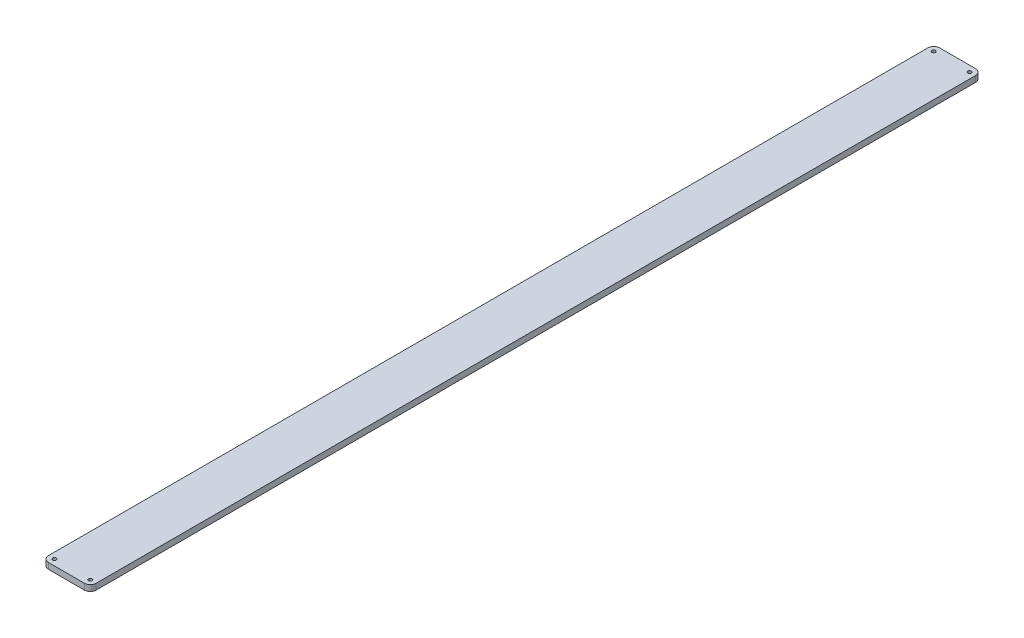
ISO-10303-21;
HEADER;
FILE_DESCRIPTION(('STEP AP214'),'2;1');
FILE_NAME('part.step','',(''),(''),'','','');
FILE_SCHEMA(('AUTOMOTIVE_DESIGN { 1 0 10303 214 1 1 1 1 }'));
ENDSEC;
DATA;
#1=APPLICATION_CONTEXT('core data for automotive mechanical design processes');
#2=APPLICATION_PROTOCOL_DEFINITION('international standard','automotive_design',2000,#1);
#3=PRODUCT_CONTEXT('',#1,'mechanical');
#4=PRODUCT('Part','Part','',(#3));
#5=PRODUCT_RELATED_PRODUCT_CATEGORY('part','',(#4));
#6=PRODUCT_DEFINITION_FORMATION('','',#4);
#7=PRODUCT_DEFINITION_CONTEXT('part definition',#1,'design');
#8=PRODUCT_DEFINITION('design','',#6,#7);
#9=PRODUCT_DEFINITION_SHAPE('','',#8);
#10=(LENGTH_UNIT() NAMED_UNIT(*) SI_UNIT(.MILLI.,.METRE.));
#11=(NAMED_UNIT(*) PLANE_ANGLE_UNIT() SI_UNIT($,.RADIAN.));
#12=(NAMED_UNIT(*) SI_UNIT($,.STERADIAN.) SOLID_ANGLE_UNIT());
#13=UNCERTAINTY_MEASURE_WITH_UNIT(LENGTH_MEASURE(1.E-05),#10,'distance_accuracy_value','');
#14=(GEOMETRIC_REPRESENTATION_CONTEXT(3) GLOBAL_UNCERTAINTY_ASSIGNED_CONTEXT((#13)) GLOBAL_UNIT_ASSIGNED_CONTEXT((#10,
#11,#12)) REPRESENTATION_CONTEXT('',''));
#15=CARTESIAN_POINT('',(0.,0.,0.));
#16=DIRECTION('',(0.,0.,1.));
#17=DIRECTION('',(1.,0.,0.));
#18=AXIS2_PLACEMENT_3D('',#15,#16,#17);
#19=CARTESIAN_POINT('',(0.,5.,0.));
#20=DIRECTION('',(0.,-1.,0.));
#21=DIRECTION('',(0.,0.,-1.));
#22=AXIS2_PLACEMENT_3D('',#19,#20,#21);
#23=PLANE('',#22);
#24=DIRECTION('',(-1.,0.,0.));
#25=VECTOR('',#24,1.);
#26=CARTESIAN_POINT('',(-20.,5.,-373.));
#27=LINE('',#26,#25);
#28=CARTESIAN_POINT('',(15.,5.,-373.));
#29=VERTEX_POINT('',#28);
#30=CARTESIAN_POINT('',(-15.,5.,-373.));
#31=VERTEX_POINT('',#30);
#32=EDGE_CURVE('E170',#29,#31,#27,.T.);
#33=ORIENTED_EDGE('',*,*,#32,.T.);
#34=CARTESIAN_POINT('',(-15.,5.,-368.));
#35=DIRECTION('',(0.,-1.,0.));
#36=DIRECTION('',(0.,0.,-1.));
#37=AXIS2_PLACEMENT_3D('',#34,#35,#36);
#38=CIRCLE('',#37,5.);
#39=CARTESIAN_POINT('',(-20.,5.,-368.));
#40=VERTEX_POINT('',#39);
#41=EDGE_CURVE('E150',#31,#40,#38,.F.);
#42=ORIENTED_EDGE('',*,*,#41,.T.);
#43=DIRECTION('',(0.,0.,1.));
#44=VECTOR('',#43,1.);
#45=CARTESIAN_POINT('',(-19.9999999999998,5.,373.));
#46=LINE('',#45,#44);
#47=CARTESIAN_POINT('',(-19.9999999999998,5.,368.));
#48=VERTEX_POINT('',#47);
#49=EDGE_CURVE('E120',#40,#48,#46,.T.);
#50=ORIENTED_EDGE('',*,*,#49,.T.);
#51=CARTESIAN_POINT('',(-14.9999999999998,5.,368.));
#52=DIRECTION('',(0.,-1.,0.));
#53=DIRECTION('',(0.,0.,-1.));
#54=AXIS2_PLACEMENT_3D('',#51,#52,#53);
#55=CIRCLE('',#54,5.);
#56=CARTESIAN_POINT('',(-14.9999999999998,5.,373.));
#57=VERTEX_POINT('',#56);
#58=EDGE_CURVE('E56',#48,#57,#55,.F.);
#59=ORIENTED_EDGE('',*,*,#58,.T.);
#60=DIRECTION('',(1.,0.,0.));
#61=VECTOR('',#60,1.);
#62=CARTESIAN_POINT('',(-19.9999999999998,5.,373.));
#63=LINE('',#62,#61);
#64=CARTESIAN_POINT('',(15.,5.,373.));
#65=VERTEX_POINT('',#64);
#66=EDGE_CURVE('E137',#57,#65,#63,.T.);
#67=ORIENTED_EDGE('',*,*,#66,.T.);
#68=CARTESIAN_POINT('',(15.,5.,368.));
#69=DIRECTION('',(0.,-1.,0.));
#70=DIRECTION('',(0.,0.,-1.));
#71=AXIS2_PLACEMENT_3D('',#68,#69,#70);
#72=CIRCLE('',#71,5.);
#73=CARTESIAN_POINT('',(20.,5.,368.));
#74=VERTEX_POINT('',#73);
#75=EDGE_CURVE('E145',#65,#74,#72,.F.);
#76=ORIENTED_EDGE('',*,*,#75,.T.);
#77=DIRECTION('',(0.,0.,-1.));
#78=VECTOR('',#77,1.);
#79=CARTESIAN_POINT('',(20.,5.,373.));
#80=LINE('',#79,#78);
#81=CARTESIAN_POINT('',(20.,5.,-368.));
#82=VERTEX_POINT('',#81);
#83=EDGE_CURVE('E131',#74,#82,#80,.T.);
#84=ORIENTED_EDGE('',*,*,#83,.T.);
#85=CARTESIAN_POINT('',(15.,5.,-368.));
#86=DIRECTION('',(0.,-1.,0.));
#87=DIRECTION('',(0.,0.,-1.));
#88=AXIS2_PLACEMENT_3D('',#85,#86,#87);
#89=CIRCLE('',#88,5.);
#90=EDGE_CURVE('E148',#82,#29,#89,.F.);
#91=ORIENTED_EDGE('',*,*,#90,.T.);
#92=EDGE_LOOP('',(#33,#42,#50,#59,#67,#76,#84,#91));
#93=FACE_BOUND('',#92,.T.);
#94=CARTESIAN_POINT('',(15.,5.,-368.));
#95=DIRECTION('',(0.,1.,0.));
#96=DIRECTION('',(0.,0.,1.));
#97=AXIS2_PLACEMENT_3D('',#94,#95,#96);
#98=CIRCLE('',#97,1.5);
#99=CARTESIAN_POINT('',(15.,5.,-366.5));
#100=VERTEX_POINT('',#99);
#101=EDGE_CURVE('E176',#100,#100,#98,.T.);
#102=ORIENTED_EDGE('',*,*,#101,.F.);
#103=EDGE_LOOP('',(#102));
#104=FACE_BOUND('',#103,.T.);
#105=CARTESIAN_POINT('',(-15.,5.,-368.));
#106=DIRECTION('',(0.,1.,0.));
#107=DIRECTION('',(0.,0.,-1.));
#108=AXIS2_PLACEMENT_3D('',#105,#106,#107);
#109=CIRCLE('',#108,1.5);
#110=CARTESIAN_POINT('',(-15.,5.,-369.5));
#111=VERTEX_POINT('',#110);
#112=EDGE_CURVE('E185',#111,#111,#109,.T.);
#113=ORIENTED_EDGE('',*,*,#112,.F.);
#114=EDGE_LOOP('',(#113));
#115=FACE_BOUND('',#114,.T.);
#116=CARTESIAN_POINT('',(-15.,5.,368.));
#117=DIRECTION('',(0.,1.,0.));
#118=DIRECTION('',(0.,0.,1.));
#119=AXIS2_PLACEMENT_3D('',#116,#117,#118);
#120=CIRCLE('',#119,1.5);
#121=CARTESIAN_POINT('',(-15.,5.,369.5));
#122=VERTEX_POINT('',#121);
#123=EDGE_CURVE('E190',#122,#122,#120,.T.);
#124=ORIENTED_EDGE('',*,*,#123,.F.);
#125=EDGE_LOOP('',(#124));
#126=FACE_BOUND('',#125,.T.);
#127=CARTESIAN_POINT('',(15.,5.,368.));
#128=DIRECTION('',(0.,1.,0.));
#129=DIRECTION('',(0.,0.,-1.));
#130=AXIS2_PLACEMENT_3D('',#127,#128,#129);
#131=CIRCLE('',#130,1.5);
#132=CARTESIAN_POINT('',(15.,5.,366.5));
#133=VERTEX_POINT('',#132);
#134=EDGE_CURVE('E196',#133,#133,#131,.T.);
#135=ORIENTED_EDGE('',*,*,#134,.F.);
#136=EDGE_LOOP('',(#135));
#137=FACE_BOUND('',#136,.T.);
#138=ADVANCED_FACE('F35',(#93,#104,#115,#126,#137),#23,.F.);
#139=CARTESIAN_POINT('',(0.,0.,0.));
#140=DIRECTION('',(0.,-1.,0.));
#141=DIRECTION('',(0.,0.,-1.));
#142=AXIS2_PLACEMENT_3D('',#139,#140,#141);
#143=PLANE('',#142);
#144=CARTESIAN_POINT('',(-15.,0.,368.));
#145=DIRECTION('',(0.,1.,0.));
#146=DIRECTION('',(0.,0.,1.));
#147=AXIS2_PLACEMENT_3D('',#144,#145,#146);
#148=CIRCLE('',#147,1.5);
#149=CARTESIAN_POINT('',(-15.,0.,369.5));
#150=VERTEX_POINT('',#149);
#151=EDGE_CURVE('E193',#150,#150,#148,.T.);
#152=ORIENTED_EDGE('',*,*,#151,.T.);
#153=EDGE_LOOP('',(#152));
#154=FACE_BOUND('',#153,.T.);
#155=CARTESIAN_POINT('',(15.,0.,-368.));
#156=DIRECTION('',(0.,1.,0.));
#157=DIRECTION('',(0.,0.,1.));
#158=AXIS2_PLACEMENT_3D('',#155,#156,#157);
#159=CIRCLE('',#158,1.5);
#160=CARTESIAN_POINT('',(15.,0.,-366.5));
#161=VERTEX_POINT('',#160);
#162=EDGE_CURVE('E178',#161,#161,#159,.T.);
#163=ORIENTED_EDGE('',*,*,#162,.T.);
#164=EDGE_LOOP('',(#163));
#165=FACE_BOUND('',#164,.T.);
#166=DIRECTION('',(0.,0.,1.));
#167=VECTOR('',#166,1.);
#168=CARTESIAN_POINT('',(-19.9999999999998,0.,373.));
#169=LINE('',#168,#167);
#170=CARTESIAN_POINT('',(-20.,0.,-368.));
#171=VERTEX_POINT('',#170);
#172=CARTESIAN_POINT('',(-19.9999999999998,0.,368.));
#173=VERTEX_POINT('',#172);
#174=EDGE_CURVE('E118',#171,#173,#169,.T.);
#175=ORIENTED_EDGE('',*,*,#174,.F.);
#176=CARTESIAN_POINT('',(-15.,0.,-368.));
#177=DIRECTION('',(0.,-1.,0.));
#178=DIRECTION('',(0.,0.,-1.));
#179=AXIS2_PLACEMENT_3D('',#176,#177,#178);
#180=CIRCLE('',#179,5.);
#181=CARTESIAN_POINT('',(-15.,0.,-373.));
#182=VERTEX_POINT('',#181);
#183=EDGE_CURVE('E101',#171,#182,#180,.T.);
#184=ORIENTED_EDGE('',*,*,#183,.T.);
#185=DIRECTION('',(-1.,0.,0.));
#186=VECTOR('',#185,1.);
#187=CARTESIAN_POINT('',(-20.,0.,-373.));
#188=LINE('',#187,#186);
#189=CARTESIAN_POINT('',(15.,0.,-373.));
#190=VERTEX_POINT('',#189);
#191=EDGE_CURVE('E129',#190,#182,#188,.T.);
#192=ORIENTED_EDGE('',*,*,#191,.F.);
#193=CARTESIAN_POINT('',(15.,0.,-368.));
#194=DIRECTION('',(0.,-1.,0.));
#195=DIRECTION('',(0.,0.,-1.));
#196=AXIS2_PLACEMENT_3D('',#193,#194,#195);
#197=CIRCLE('',#196,5.);
#198=CARTESIAN_POINT('',(20.,0.,-368.));
#199=VERTEX_POINT('',#198);
#200=EDGE_CURVE('E112',#190,#199,#197,.T.);
#201=ORIENTED_EDGE('',*,*,#200,.T.);
#202=DIRECTION('',(0.,0.,-1.));
#203=VECTOR('',#202,1.);
#204=CARTESIAN_POINT('',(20.,0.,373.));
#205=LINE('',#204,#203);
#206=CARTESIAN_POINT('',(20.,0.,368.));
#207=VERTEX_POINT('',#206);
#208=EDGE_CURVE('E133',#207,#199,#205,.T.);
#209=ORIENTED_EDGE('',*,*,#208,.F.);
#210=CARTESIAN_POINT('',(15.,0.,368.));
#211=DIRECTION('',(0.,-1.,0.));
#212=DIRECTION('',(0.,0.,-1.));
#213=AXIS2_PLACEMENT_3D('',#210,#211,#212);
#214=CIRCLE('',#213,5.);
#215=CARTESIAN_POINT('',(15.,0.,373.));
#216=VERTEX_POINT('',#215);
#217=EDGE_CURVE('E121',#207,#216,#214,.T.);
#218=ORIENTED_EDGE('',*,*,#217,.T.);
#219=DIRECTION('',(1.,0.,0.));
#220=VECTOR('',#219,1.);
#221=CARTESIAN_POINT('',(-19.9999999999998,0.,373.));
#222=LINE('',#221,#220);
#223=CARTESIAN_POINT('',(-14.9999999999998,0.,373.));
#224=VERTEX_POINT('',#223);
#225=EDGE_CURVE('E128',#224,#216,#222,.T.);
#226=ORIENTED_EDGE('',*,*,#225,.F.);
#227=CARTESIAN_POINT('',(-14.9999999999998,0.,368.));
#228=DIRECTION('',(0.,-1.,0.));
#229=DIRECTION('',(0.,0.,-1.));
#230=AXIS2_PLACEMENT_3D('',#227,#228,#229);
#231=CIRCLE('',#230,5.);
#232=EDGE_CURVE('E127',#224,#173,#231,.T.);
#233=ORIENTED_EDGE('',*,*,#232,.T.);
#234=EDGE_LOOP('',(#175,#184,#192,#201,#209,#218,#226,#233));
#235=FACE_BOUND('',#234,.T.);
#236=CARTESIAN_POINT('',(-15.,0.,-368.));
#237=DIRECTION('',(0.,1.,0.));
#238=DIRECTION('',(0.,0.,-1.));
#239=AXIS2_PLACEMENT_3D('',#236,#237,#238);
#240=CIRCLE('',#239,1.5);
#241=CARTESIAN_POINT('',(-15.,0.,-369.5));
#242=VERTEX_POINT('',#241);
#243=EDGE_CURVE('E187',#242,#242,#240,.T.);
#244=ORIENTED_EDGE('',*,*,#243,.T.);
#245=EDGE_LOOP('',(#244));
#246=FACE_BOUND('',#245,.T.);
#247=CARTESIAN_POINT('',(15.,0.,368.));
#248=DIRECTION('',(0.,1.,0.));
#249=DIRECTION('',(0.,0.,-1.));
#250=AXIS2_PLACEMENT_3D('',#247,#248,#249);
#251=CIRCLE('',#250,1.5);
#252=CARTESIAN_POINT('',(15.,0.,366.5));
#253=VERTEX_POINT('',#252);
#254=EDGE_CURVE('E199',#253,#253,#251,.T.);
#255=ORIENTED_EDGE('',*,*,#254,.T.);
#256=EDGE_LOOP('',(#255));
#257=FACE_BOUND('',#256,.T.);
#258=ADVANCED_FACE('F124',(#154,#165,#235,#246,#257),#143,.T.);
#259=CARTESIAN_POINT('',(20.,5.,373.));
#260=DIRECTION('',(-1.,0.,0.));
#261=DIRECTION('',(0.,0.,1.));
#262=AXIS2_PLACEMENT_3D('',#259,#260,#261);
#263=PLANE('',#262);
#264=ORIENTED_EDGE('',*,*,#208,.T.);
#265=DIRECTION('',(0.,-1.,0.));
#266=VECTOR('',#265,1.);
#267=CARTESIAN_POINT('',(20.,5.,-368.));
#268=LINE('',#267,#266);
#269=EDGE_CURVE('E155',#199,#82,#268,.F.);
#270=ORIENTED_EDGE('',*,*,#269,.T.);
#271=ORIENTED_EDGE('',*,*,#83,.F.);
#272=DIRECTION('',(0.,-1.,0.));
#273=VECTOR('',#272,1.);
#274=CARTESIAN_POINT('',(20.,5.,368.));
#275=LINE('',#274,#273);
#276=EDGE_CURVE('E152',#74,#207,#275,.T.);
#277=ORIENTED_EDGE('',*,*,#276,.T.);
#278=EDGE_LOOP('',(#264,#270,#271,#277));
#279=FACE_BOUND('',#278,.T.);
#280=ADVANCED_FACE('F161',(#279),#263,.F.);
#281=CARTESIAN_POINT('',(-20.,5.,-373.));
#282=DIRECTION('',(0.,0.,1.));
#283=DIRECTION('',(1.,0.,0.));
#284=AXIS2_PLACEMENT_3D('',#281,#282,#283);
#285=PLANE('',#284);
#286=ORIENTED_EDGE('',*,*,#191,.T.);
#287=DIRECTION('',(0.,-1.,0.));
#288=VECTOR('',#287,1.);
#289=CARTESIAN_POINT('',(-15.,5.,-373.));
#290=LINE('',#289,#288);
#291=EDGE_CURVE('E106',#182,#31,#290,.F.);
#292=ORIENTED_EDGE('',*,*,#291,.T.);
#293=ORIENTED_EDGE('',*,*,#32,.F.);
#294=DIRECTION('',(0.,-1.,0.));
#295=VECTOR('',#294,1.);
#296=CARTESIAN_POINT('',(15.,5.,-373.));
#297=LINE('',#296,#295);
#298=EDGE_CURVE('E111',#29,#190,#297,.T.);
#299=ORIENTED_EDGE('',*,*,#298,.T.);
#300=EDGE_LOOP('',(#286,#292,#293,#299));
#301=FACE_BOUND('',#300,.T.);
#302=ADVANCED_FACE('F175',(#301),#285,.F.);
#303=CARTESIAN_POINT('',(-19.9999999999998,5.,373.));
#304=DIRECTION('',(1.,0.,0.));
#305=DIRECTION('',(0.,0.,-1.));
#306=AXIS2_PLACEMENT_3D('',#303,#304,#305);
#307=PLANE('',#306);
#308=ORIENTED_EDGE('',*,*,#49,.F.);
#309=DIRECTION('',(0.,-1.,0.));
#310=VECTOR('',#309,1.);
#311=CARTESIAN_POINT('',(-20.,5.,-368.));
#312=LINE('',#311,#310);
#313=EDGE_CURVE('E105',#40,#171,#312,.T.);
#314=ORIENTED_EDGE('',*,*,#313,.T.);
#315=ORIENTED_EDGE('',*,*,#174,.T.);
#316=DIRECTION('',(0.,-1.,0.));
#317=VECTOR('',#316,1.);
#318=CARTESIAN_POINT('',(-19.9999999999998,5.,368.));
#319=LINE('',#318,#317);
#320=EDGE_CURVE('E122',#173,#48,#319,.F.);
#321=ORIENTED_EDGE('',*,*,#320,.T.);
#322=EDGE_LOOP('',(#308,#314,#315,#321));
#323=FACE_BOUND('',#322,.T.);
#324=ADVANCED_FACE('F117',(#323),#307,.F.);
#325=CARTESIAN_POINT('',(-19.9999999999998,5.,373.));
#326=DIRECTION('',(0.,0.,-1.));
#327=DIRECTION('',(-1.,0.,0.));
#328=AXIS2_PLACEMENT_3D('',#325,#326,#327);
#329=PLANE('',#328);
#330=ORIENTED_EDGE('',*,*,#66,.F.);
#331=DIRECTION('',(0.,-1.,0.));
#332=VECTOR('',#331,1.);
#333=CARTESIAN_POINT('',(-14.9999999999998,5.,373.));
#334=LINE('',#333,#332);
#335=EDGE_CURVE('E11',#57,#224,#334,.T.);
#336=ORIENTED_EDGE('',*,*,#335,.T.);
#337=ORIENTED_EDGE('',*,*,#225,.T.);
#338=DIRECTION('',(0.,-1.,0.));
#339=VECTOR('',#338,1.);
#340=CARTESIAN_POINT('',(15.,5.,373.));
#341=LINE('',#340,#339);
#342=EDGE_CURVE('E43',#216,#65,#341,.F.);
#343=ORIENTED_EDGE('',*,*,#342,.T.);
#344=EDGE_LOOP('',(#330,#336,#337,#343));
#345=FACE_BOUND('',#344,.T.);
#346=ADVANCED_FACE('F219',(#345),#329,.F.);
#347=CARTESIAN_POINT('',(15.,5.,-368.));
#348=DIRECTION('',(0.,-1.,0.));
#349=DIRECTION('',(0.,0.,-1.));
#350=AXIS2_PLACEMENT_3D('',#347,#348,#349);
#351=CYLINDRICAL_SURFACE('',#350,1.5);
#352=ORIENTED_EDGE('',*,*,#101,.T.);
#353=EDGE_LOOP('',(#352));
#354=FACE_BOUND('',#353,.T.);
#355=ORIENTED_EDGE('',*,*,#162,.F.);
#356=EDGE_LOOP('',(#355));
#357=FACE_BOUND('',#356,.T.);
#358=ADVANCED_FACE('F216',(#354,#357),#351,.F.);
#359=CARTESIAN_POINT('',(-15.,5.,-368.));
#360=DIRECTION('',(0.,-1.,0.));
#361=DIRECTION('',(0.,0.,-1.));
#362=AXIS2_PLACEMENT_3D('',#359,#360,#361);
#363=CYLINDRICAL_SURFACE('',#362,1.5);
#364=ORIENTED_EDGE('',*,*,#112,.T.);
#365=EDGE_LOOP('',(#364));
#366=FACE_BOUND('',#365,.T.);
#367=ORIENTED_EDGE('',*,*,#243,.F.);
#368=EDGE_LOOP('',(#367));
#369=FACE_BOUND('',#368,.T.);
#370=ADVANCED_FACE('F311',(#366,#369),#363,.F.);
#371=CARTESIAN_POINT('',(-15.,5.,368.));
#372=DIRECTION('',(0.,-1.,0.));
#373=DIRECTION('',(0.,0.,-1.));
#374=AXIS2_PLACEMENT_3D('',#371,#372,#373);
#375=CYLINDRICAL_SURFACE('',#374,1.5);
#376=ORIENTED_EDGE('',*,*,#123,.T.);
#377=EDGE_LOOP('',(#376));
#378=FACE_BOUND('',#377,.T.);
#379=ORIENTED_EDGE('',*,*,#151,.F.);
#380=EDGE_LOOP('',(#379));
#381=FACE_BOUND('',#380,.T.);
#382=ADVANCED_FACE('F302',(#378,#381),#375,.F.);
#383=CARTESIAN_POINT('',(15.,5.,368.));
#384=DIRECTION('',(0.,-1.,0.));
#385=DIRECTION('',(0.,0.,-1.));
#386=AXIS2_PLACEMENT_3D('',#383,#384,#385);
#387=CYLINDRICAL_SURFACE('',#386,1.5);
#388=ORIENTED_EDGE('',*,*,#134,.T.);
#389=EDGE_LOOP('',(#388));
#390=FACE_BOUND('',#389,.T.);
#391=ORIENTED_EDGE('',*,*,#254,.F.);
#392=EDGE_LOOP('',(#391));
#393=FACE_BOUND('',#392,.T.);
#394=ADVANCED_FACE('F205',(#390,#393),#387,.F.);
#395=CARTESIAN_POINT('',(-15.,5.,-368.));
#396=DIRECTION('',(0.,-1.,0.));
#397=DIRECTION('',(0.,0.,-1.));
#398=AXIS2_PLACEMENT_3D('',#395,#396,#397);
#399=CYLINDRICAL_SURFACE('',#398,5.);
#400=ORIENTED_EDGE('',*,*,#41,.F.);
#401=ORIENTED_EDGE('',*,*,#291,.F.);
#402=ORIENTED_EDGE('',*,*,#183,.F.);
#403=ORIENTED_EDGE('',*,*,#313,.F.);
#404=EDGE_LOOP('',(#400,#401,#402,#403));
#405=FACE_BOUND('',#404,.T.);
#406=ADVANCED_FACE('F104',(#405),#399,.T.);
#407=CARTESIAN_POINT('',(15.,5.,-368.));
#408=DIRECTION('',(0.,-1.,0.));
#409=DIRECTION('',(0.,0.,-1.));
#410=AXIS2_PLACEMENT_3D('',#407,#408,#409);
#411=CYLINDRICAL_SURFACE('',#410,5.);
#412=ORIENTED_EDGE('',*,*,#90,.F.);
#413=ORIENTED_EDGE('',*,*,#269,.F.);
#414=ORIENTED_EDGE('',*,*,#200,.F.);
#415=ORIENTED_EDGE('',*,*,#298,.F.);
#416=EDGE_LOOP('',(#412,#413,#414,#415));
#417=FACE_BOUND('',#416,.T.);
#418=ADVANCED_FACE('F173',(#417),#411,.T.);
#419=CARTESIAN_POINT('',(-14.9999999999998,5.,368.));
#420=DIRECTION('',(0.,-1.,0.));
#421=DIRECTION('',(0.,0.,-1.));
#422=AXIS2_PLACEMENT_3D('',#419,#420,#421);
#423=CYLINDRICAL_SURFACE('',#422,5.);
#424=ORIENTED_EDGE('',*,*,#58,.F.);
#425=ORIENTED_EDGE('',*,*,#320,.F.);
#426=ORIENTED_EDGE('',*,*,#232,.F.);
#427=ORIENTED_EDGE('',*,*,#335,.F.);
#428=EDGE_LOOP('',(#424,#425,#426,#427));
#429=FACE_BOUND('',#428,.T.);
#430=ADVANCED_FACE('F231',(#429),#423,.T.);
#431=CARTESIAN_POINT('',(15.,5.,368.));
#432=DIRECTION('',(0.,-1.,0.));
#433=DIRECTION('',(0.,0.,-1.));
#434=AXIS2_PLACEMENT_3D('',#431,#432,#433);
#435=CYLINDRICAL_SURFACE('',#434,5.);
#436=ORIENTED_EDGE('',*,*,#75,.F.);
#437=ORIENTED_EDGE('',*,*,#342,.F.);
#438=ORIENTED_EDGE('',*,*,#217,.F.);
#439=ORIENTED_EDGE('',*,*,#276,.F.);
#440=EDGE_LOOP('',(#436,#437,#438,#439));
#441=FACE_BOUND('',#440,.T.);
#442=ADVANCED_FACE('F37',(#441),#435,.T.);
#443=CLOSED_SHELL('',(#138,#258,#280,#302,#324,#346,#358,#370,#382,#394,#406,#418,#430,#442));
#444=MANIFOLD_SOLID_BREP('B2',#443);
#445=ADVANCED_BREP_SHAPE_REPRESENTATION('',(#18,#444),#14);
#446=SHAPE_DEFINITION_REPRESENTATION(#9,#445);
ENDSEC;
END-ISO-10303-21;
